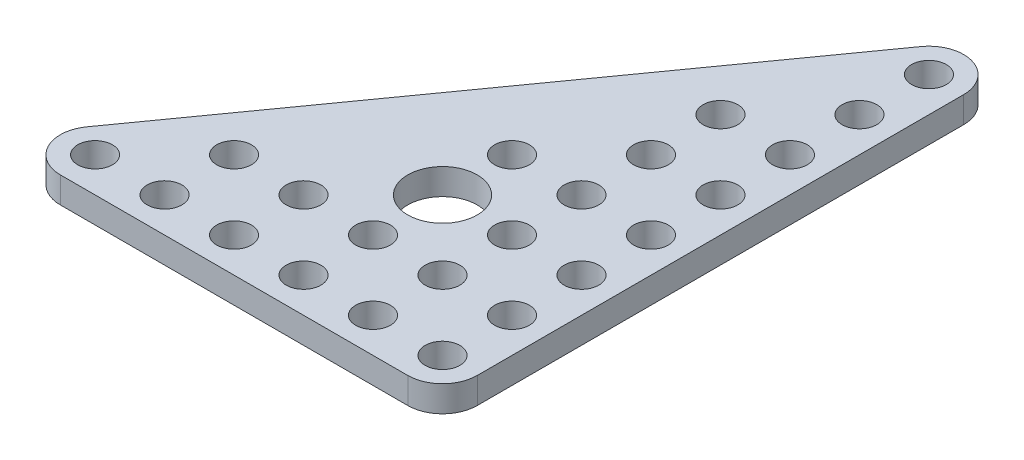
ISO-10303-21;
HEADER;
FILE_DESCRIPTION(('STEP AP214'),'2;1');
FILE_NAME('part.step','',(''),(''),'','','');
FILE_SCHEMA(('AUTOMOTIVE_DESIGN { 1 0 10303 214 1 1 1 1 }'));
ENDSEC;
DATA;
#1=APPLICATION_CONTEXT('core data for automotive mechanical design processes');
#2=APPLICATION_PROTOCOL_DEFINITION('international standard','automotive_design',2000,#1);
#3=PRODUCT_CONTEXT('',#1,'mechanical');
#4=PRODUCT('Part','Part','',(#3));
#5=PRODUCT_RELATED_PRODUCT_CATEGORY('part','',(#4));
#6=PRODUCT_DEFINITION_FORMATION('','',#4);
#7=PRODUCT_DEFINITION_CONTEXT('part definition',#1,'design');
#8=PRODUCT_DEFINITION('design','',#6,#7);
#9=PRODUCT_DEFINITION_SHAPE('','',#8);
#10=(LENGTH_UNIT() NAMED_UNIT(*) SI_UNIT(.MILLI.,.METRE.));
#11=(NAMED_UNIT(*) PLANE_ANGLE_UNIT() SI_UNIT($,.RADIAN.));
#12=(NAMED_UNIT(*) SI_UNIT($,.STERADIAN.) SOLID_ANGLE_UNIT());
#13=UNCERTAINTY_MEASURE_WITH_UNIT(LENGTH_MEASURE(1.E-05),#10,'distance_accuracy_value','');
#14=(GEOMETRIC_REPRESENTATION_CONTEXT(3) GLOBAL_UNCERTAINTY_ASSIGNED_CONTEXT((#13)) GLOBAL_UNIT_ASSIGNED_CONTEXT((#10,
#11,#12)) REPRESENTATION_CONTEXT('',''));
#15=CARTESIAN_POINT('',(0.,0.,0.));
#16=DIRECTION('',(0.,0.,1.));
#17=DIRECTION('',(1.,0.,0.));
#18=AXIS2_PLACEMENT_3D('',#15,#16,#17);
#19=CARTESIAN_POINT('',(13.1803752718985,3.,-33.0711553624912));
#20=DIRECTION('',(0.,-1.,0.));
#21=DIRECTION('',(0.,0.,-1.));
#22=AXIS2_PLACEMENT_3D('',#19,#20,#21);
#23=CYLINDRICAL_SURFACE('',#22,4.);
#24=CARTESIAN_POINT('',(13.1803752718985,0.,-33.0711553624912));
#25=DIRECTION('',(0.,1.,0.));
#26=DIRECTION('',(0.,0.,1.));
#27=AXIS2_PLACEMENT_3D('',#24,#25,#26);
#28=CIRCLE('',#27,4.);
#29=CARTESIAN_POINT('',(17.1803752718985,0.,-33.0711553624912));
#30=VERTEX_POINT('',#29);
#31=CARTESIAN_POINT('',(9.9254413870716,0.,-35.3961081373676));
#32=VERTEX_POINT('',#31);
#33=EDGE_CURVE('E121',#30,#32,#28,.T.);
#34=ORIENTED_EDGE('',*,*,#33,.T.);
#35=DIRECTION('',(0.,-1.,0.));
#36=VECTOR('',#35,1.);
#37=CARTESIAN_POINT('',(9.9254413870716,3.,-35.3961081373676));
#38=LINE('',#37,#36);
#39=CARTESIAN_POINT('',(9.9254413870716,3.,-35.3961081373676));
#40=VERTEX_POINT('',#39);
#41=EDGE_CURVE('E11',#40,#32,#38,.T.);
#42=ORIENTED_EDGE('',*,*,#41,.F.);
#43=CARTESIAN_POINT('',(13.1803752718985,3.,-33.0711553624912));
#44=DIRECTION('',(0.,1.,0.));
#45=DIRECTION('',(0.,0.,1.));
#46=AXIS2_PLACEMENT_3D('',#43,#44,#45);
#47=CIRCLE('',#46,4.);
#48=CARTESIAN_POINT('',(17.1803752718985,3.,-33.0711553624912));
#49=VERTEX_POINT('',#48);
#50=EDGE_CURVE('E133',#49,#40,#47,.T.);
#51=ORIENTED_EDGE('',*,*,#50,.F.);
#52=DIRECTION('',(0.,-1.,0.));
#53=VECTOR('',#52,1.);
#54=CARTESIAN_POINT('',(17.1803752718985,3.,-33.0711553624912));
#55=LINE('',#54,#53);
#56=EDGE_CURVE('E117',#49,#30,#55,.T.);
#57=ORIENTED_EDGE('',*,*,#56,.T.);
#58=EDGE_LOOP('',(#34,#42,#51,#57));
#59=FACE_BOUND('',#58,.T.);
#60=ADVANCED_FACE('F38',(#59),#23,.T.);
#61=CARTESIAN_POINT('',(9.9254413870716,3.,-35.3961081373676));
#62=DIRECTION('',(0.813733471206735,0.,0.581238193719096));
#63=DIRECTION('',(0.581238193719096,0.,-0.813733471206735));
#64=AXIS2_PLACEMENT_3D('',#61,#62,#63);
#65=PLANE('',#64);
#66=DIRECTION('',(-0.581238193719096,0.,0.813733471206735));
#67=VECTOR('',#66,1.);
#68=CARTESIAN_POINT('',(9.9254413870716,0.,-35.3961081373676));
#69=LINE('',#68,#67);
#70=CARTESIAN_POINT('',(-30.0745586129284,0.,20.6038918626324));
#71=VERTEX_POINT('',#70);
#72=EDGE_CURVE('E124',#32,#71,#69,.T.);
#73=ORIENTED_EDGE('',*,*,#72,.T.);
#74=DIRECTION('',(0.,-1.,0.));
#75=VECTOR('',#74,1.);
#76=CARTESIAN_POINT('',(-30.0745586129284,3.,20.6038918626324));
#77=LINE('',#76,#75);
#78=CARTESIAN_POINT('',(-30.0745586129284,3.,20.6038918626324));
#79=VERTEX_POINT('',#78);
#80=EDGE_CURVE('E46',#79,#71,#77,.T.);
#81=ORIENTED_EDGE('',*,*,#80,.F.);
#82=DIRECTION('',(-0.581238193719096,0.,0.813733471206735));
#83=VECTOR('',#82,1.);
#84=CARTESIAN_POINT('',(9.9254413870716,3.,-35.3961081373676));
#85=LINE('',#84,#83);
#86=EDGE_CURVE('E87',#40,#79,#85,.T.);
#87=ORIENTED_EDGE('',*,*,#86,.F.);
#88=ORIENTED_EDGE('',*,*,#41,.T.);
#89=EDGE_LOOP('',(#73,#81,#87,#88));
#90=FACE_BOUND('',#89,.T.);
#91=ADVANCED_FACE('F158',(#90),#65,.F.);
#92=CARTESIAN_POINT('',(-26.8196247281015,3.,22.9288446375088));
#93=DIRECTION('',(0.,-1.,0.));
#94=DIRECTION('',(0.,0.,-1.));
#95=AXIS2_PLACEMENT_3D('',#92,#93,#94);
#96=CYLINDRICAL_SURFACE('',#95,4.00000000000001);
#97=CARTESIAN_POINT('',(-26.8196247281015,0.,22.9288446375088));
#98=DIRECTION('',(0.,1.,0.));
#99=DIRECTION('',(0.,0.,1.));
#100=AXIS2_PLACEMENT_3D('',#97,#98,#99);
#101=CIRCLE('',#100,4.00000000000001);
#102=CARTESIAN_POINT('',(-26.8196247281015,0.,26.9288446375088));
#103=VERTEX_POINT('',#102);
#104=EDGE_CURVE('E127',#71,#103,#101,.T.);
#105=ORIENTED_EDGE('',*,*,#104,.T.);
#106=DIRECTION('',(0.,-1.,0.));
#107=VECTOR('',#106,1.);
#108=CARTESIAN_POINT('',(-26.8196247281015,3.,26.9288446375088));
#109=LINE('',#108,#107);
#110=CARTESIAN_POINT('',(-26.8196247281015,3.,26.9288446375088));
#111=VERTEX_POINT('',#110);
#112=EDGE_CURVE('E113',#111,#103,#109,.T.);
#113=ORIENTED_EDGE('',*,*,#112,.F.);
#114=CARTESIAN_POINT('',(-26.8196247281015,3.,22.9288446375088));
#115=DIRECTION('',(0.,1.,0.));
#116=DIRECTION('',(0.,0.,1.));
#117=AXIS2_PLACEMENT_3D('',#114,#115,#116);
#118=CIRCLE('',#117,4.00000000000001);
#119=EDGE_CURVE('E100',#79,#111,#118,.T.);
#120=ORIENTED_EDGE('',*,*,#119,.F.);
#121=ORIENTED_EDGE('',*,*,#80,.T.);
#122=EDGE_LOOP('',(#105,#113,#120,#121));
#123=FACE_BOUND('',#122,.T.);
#124=ADVANCED_FACE('F139',(#123),#96,.T.);
#125=CARTESIAN_POINT('',(-26.8196247281015,3.,26.9288446375088));
#126=DIRECTION('',(0.,0.,-1.));
#127=DIRECTION('',(-1.,0.,0.));
#128=AXIS2_PLACEMENT_3D('',#125,#126,#127);
#129=PLANE('',#128);
#130=DIRECTION('',(1.,0.,0.));
#131=VECTOR('',#130,1.);
#132=CARTESIAN_POINT('',(-26.8196247281015,0.,26.9288446375088));
#133=LINE('',#132,#131);
#134=CARTESIAN_POINT('',(13.1803752718985,0.,26.9288446375088));
#135=VERTEX_POINT('',#134);
#136=EDGE_CURVE('E109',#103,#135,#133,.T.);
#137=ORIENTED_EDGE('',*,*,#136,.T.);
#138=DIRECTION('',(0.,-1.,0.));
#139=VECTOR('',#138,1.);
#140=CARTESIAN_POINT('',(13.1803752718985,3.,26.9288446375088));
#141=LINE('',#140,#139);
#142=CARTESIAN_POINT('',(13.1803752718985,3.,26.9288446375088));
#143=VERTEX_POINT('',#142);
#144=EDGE_CURVE('E106',#143,#135,#141,.T.);
#145=ORIENTED_EDGE('',*,*,#144,.F.);
#146=DIRECTION('',(1.,0.,0.));
#147=VECTOR('',#146,1.);
#148=CARTESIAN_POINT('',(-26.8196247281015,3.,26.9288446375088));
#149=LINE('',#148,#147);
#150=EDGE_CURVE('E94',#111,#143,#149,.T.);
#151=ORIENTED_EDGE('',*,*,#150,.F.);
#152=ORIENTED_EDGE('',*,*,#112,.T.);
#153=EDGE_LOOP('',(#137,#145,#151,#152));
#154=FACE_BOUND('',#153,.T.);
#155=ADVANCED_FACE('F107',(#154),#129,.F.);
#156=CARTESIAN_POINT('',(13.1803752718985,3.,22.9288446375088));
#157=DIRECTION('',(0.,-1.,0.));
#158=DIRECTION('',(0.,0.,-1.));
#159=AXIS2_PLACEMENT_3D('',#156,#157,#158);
#160=CYLINDRICAL_SURFACE('',#159,4.);
#161=CARTESIAN_POINT('',(13.1803752718985,0.,22.9288446375088));
#162=DIRECTION('',(0.,-1.,0.));
#163=DIRECTION('',(0.,0.,-1.));
#164=AXIS2_PLACEMENT_3D('',#161,#162,#163);
#165=CIRCLE('',#164,4.);
#166=CARTESIAN_POINT('',(17.1803752718985,0.,22.9288446375088));
#167=VERTEX_POINT('',#166);
#168=EDGE_CURVE('E130',#167,#135,#165,.T.);
#169=ORIENTED_EDGE('',*,*,#168,.F.);
#170=DIRECTION('',(0.,-1.,0.));
#171=VECTOR('',#170,1.);
#172=CARTESIAN_POINT('',(17.1803752718985,3.,22.9288446375088));
#173=LINE('',#172,#171);
#174=CARTESIAN_POINT('',(17.1803752718985,3.,22.9288446375088));
#175=VERTEX_POINT('',#174);
#176=EDGE_CURVE('E76',#175,#167,#173,.T.);
#177=ORIENTED_EDGE('',*,*,#176,.F.);
#178=CARTESIAN_POINT('',(13.1803752718985,3.,22.9288446375088));
#179=DIRECTION('',(0.,-1.,0.));
#180=DIRECTION('',(0.,0.,-1.));
#181=AXIS2_PLACEMENT_3D('',#178,#179,#180);
#182=CIRCLE('',#181,4.);
#183=EDGE_CURVE('E98',#175,#143,#182,.T.);
#184=ORIENTED_EDGE('',*,*,#183,.T.);
#185=ORIENTED_EDGE('',*,*,#144,.T.);
#186=EDGE_LOOP('',(#169,#177,#184,#185));
#187=FACE_BOUND('',#186,.T.);
#188=ADVANCED_FACE('F115',(#187),#160,.T.);
#189=CARTESIAN_POINT('',(17.1803752718985,3.,22.9288446375088));
#190=DIRECTION('',(-1.,0.,0.));
#191=DIRECTION('',(0.,0.,1.));
#192=AXIS2_PLACEMENT_3D('',#189,#190,#191);
#193=PLANE('',#192);
#194=DIRECTION('',(0.,0.,-1.));
#195=VECTOR('',#194,1.);
#196=CARTESIAN_POINT('',(17.1803752718985,0.,22.9288446375088));
#197=LINE('',#196,#195);
#198=EDGE_CURVE('E79',#167,#30,#197,.T.);
#199=ORIENTED_EDGE('',*,*,#198,.T.);
#200=ORIENTED_EDGE('',*,*,#56,.F.);
#201=DIRECTION('',(0.,0.,-1.));
#202=VECTOR('',#201,1.);
#203=CARTESIAN_POINT('',(17.1803752718985,3.,22.9288446375088));
#204=LINE('',#203,#202);
#205=EDGE_CURVE('E54',#175,#49,#204,.T.);
#206=ORIENTED_EDGE('',*,*,#205,.F.);
#207=ORIENTED_EDGE('',*,*,#176,.T.);
#208=EDGE_LOOP('',(#199,#200,#206,#207));
#209=FACE_BOUND('',#208,.T.);
#210=ADVANCED_FACE('F146',(#209),#193,.F.);
#211=CARTESIAN_POINT('',(13.1803752718985,3.,-33.0711553624912));
#212=DIRECTION('',(0.,1.,0.));
#213=DIRECTION('',(0.,0.,1.));
#214=AXIS2_PLACEMENT_3D('',#211,#212,#213);
#215=PLANE('',#214);
#216=CARTESIAN_POINT('',(5.18037527189854,3.,14.9288446375088));
#217=DIRECTION('',(0.,1.,0.));
#218=DIRECTION('',(0.,0.,1.));
#219=AXIS2_PLACEMENT_3D('',#216,#217,#218);
#220=CIRCLE('',#219,2.);
#221=CARTESIAN_POINT('',(5.18037527189854,3.,16.9288446375088));
#222=VERTEX_POINT('',#221);
#223=EDGE_CURVE('E125',#222,#222,#220,.F.);
#224=ORIENTED_EDGE('',*,*,#223,.T.);
#225=EDGE_LOOP('',(#224));
#226=FACE_BOUND('',#225,.T.);
#227=CARTESIAN_POINT('',(-2.81962472810146,3.,14.9288446375088));
#228=DIRECTION('',(0.,1.,0.));
#229=DIRECTION('',(0.,0.,1.));
#230=AXIS2_PLACEMENT_3D('',#227,#228,#229);
#231=CIRCLE('',#230,2.);
#232=CARTESIAN_POINT('',(-2.81962472810146,3.,16.9288446375088));
#233=VERTEX_POINT('',#232);
#234=EDGE_CURVE('E536',#233,#233,#231,.F.);
#235=ORIENTED_EDGE('',*,*,#234,.T.);
#236=EDGE_LOOP('',(#235));
#237=FACE_BOUND('',#236,.T.);
#238=CARTESIAN_POINT('',(-10.8196247281015,3.,14.9288446375088));
#239=DIRECTION('',(0.,1.,0.));
#240=DIRECTION('',(0.,0.,1.));
#241=AXIS2_PLACEMENT_3D('',#238,#239,#240);
#242=CIRCLE('',#241,2.);
#243=CARTESIAN_POINT('',(-10.8196247281015,3.,16.9288446375088));
#244=VERTEX_POINT('',#243);
#245=EDGE_CURVE('E533',#244,#244,#242,.F.);
#246=ORIENTED_EDGE('',*,*,#245,.T.);
#247=EDGE_LOOP('',(#246));
#248=FACE_BOUND('',#247,.T.);
#249=CARTESIAN_POINT('',(-18.8196247281015,3.,14.9288446375088));
#250=DIRECTION('',(0.,1.,0.));
#251=DIRECTION('',(0.,0.,1.));
#252=AXIS2_PLACEMENT_3D('',#249,#250,#251);
#253=CIRCLE('',#252,2.);
#254=CARTESIAN_POINT('',(-18.8196247281015,3.,16.9288446375088));
#255=VERTEX_POINT('',#254);
#256=EDGE_CURVE('E530',#255,#255,#253,.F.);
#257=ORIENTED_EDGE('',*,*,#256,.T.);
#258=EDGE_LOOP('',(#257));
#259=FACE_BOUND('',#258,.T.);
#260=CARTESIAN_POINT('',(-26.8196247281015,3.,22.9288446375088));
#261=DIRECTION('',(0.,1.,0.));
#262=DIRECTION('',(0.,0.,1.));
#263=AXIS2_PLACEMENT_3D('',#260,#261,#262);
#264=CIRCLE('',#263,2.);
#265=CARTESIAN_POINT('',(-26.8196247281015,3.,24.9288446375088));
#266=VERTEX_POINT('',#265);
#267=EDGE_CURVE('E527',#266,#266,#264,.F.);
#268=ORIENTED_EDGE('',*,*,#267,.T.);
#269=EDGE_LOOP('',(#268));
#270=FACE_BOUND('',#269,.T.);
#271=CARTESIAN_POINT('',(-18.8196247281015,3.,22.9288446375088));
#272=DIRECTION('',(0.,1.,0.));
#273=DIRECTION('',(0.,0.,1.));
#274=AXIS2_PLACEMENT_3D('',#271,#272,#273);
#275=CIRCLE('',#274,2.00000000000001);
#276=CARTESIAN_POINT('',(-18.8196247281015,3.,24.9288446375088));
#277=VERTEX_POINT('',#276);
#278=EDGE_CURVE('E524',#277,#277,#275,.F.);
#279=ORIENTED_EDGE('',*,*,#278,.T.);
#280=EDGE_LOOP('',(#279));
#281=FACE_BOUND('',#280,.T.);
#282=CARTESIAN_POINT('',(-10.8196247281015,3.,22.9288446375088));
#283=DIRECTION('',(0.,1.,0.));
#284=DIRECTION('',(0.,0.,1.));
#285=AXIS2_PLACEMENT_3D('',#282,#283,#284);
#286=CIRCLE('',#285,2.);
#287=CARTESIAN_POINT('',(-10.8196247281015,3.,24.9288446375088));
#288=VERTEX_POINT('',#287);
#289=EDGE_CURVE('E521',#288,#288,#286,.F.);
#290=ORIENTED_EDGE('',*,*,#289,.T.);
#291=EDGE_LOOP('',(#290));
#292=FACE_BOUND('',#291,.T.);
#293=CARTESIAN_POINT('',(-2.81962472810146,3.,22.9288446375088));
#294=DIRECTION('',(0.,1.,0.));
#295=DIRECTION('',(0.,0.,1.));
#296=AXIS2_PLACEMENT_3D('',#293,#294,#295);
#297=CIRCLE('',#296,2.);
#298=CARTESIAN_POINT('',(-2.81962472810146,3.,24.9288446375088));
#299=VERTEX_POINT('',#298);
#300=EDGE_CURVE('E518',#299,#299,#297,.F.);
#301=ORIENTED_EDGE('',*,*,#300,.T.);
#302=EDGE_LOOP('',(#301));
#303=FACE_BOUND('',#302,.T.);
#304=CARTESIAN_POINT('',(13.1803752718985,3.,14.9288446375088));
#305=DIRECTION('',(0.,1.,0.));
#306=DIRECTION('',(0.,0.,1.));
#307=AXIS2_PLACEMENT_3D('',#304,#305,#306);
#308=CIRCLE('',#307,2.);
#309=CARTESIAN_POINT('',(13.1803752718985,3.,16.9288446375088));
#310=VERTEX_POINT('',#309);
#311=EDGE_CURVE('E515',#310,#310,#308,.F.);
#312=ORIENTED_EDGE('',*,*,#311,.T.);
#313=EDGE_LOOP('',(#312));
#314=FACE_BOUND('',#313,.T.);
#315=CARTESIAN_POINT('',(13.1803752718985,3.,6.92884463750881));
#316=DIRECTION('',(0.,1.,0.));
#317=DIRECTION('',(0.,0.,1.));
#318=AXIS2_PLACEMENT_3D('',#315,#316,#317);
#319=CIRCLE('',#318,2.);
#320=CARTESIAN_POINT('',(13.1803752718985,3.,8.92884463750881));
#321=VERTEX_POINT('',#320);
#322=EDGE_CURVE('E512',#321,#321,#319,.F.);
#323=ORIENTED_EDGE('',*,*,#322,.T.);
#324=EDGE_LOOP('',(#323));
#325=FACE_BOUND('',#324,.T.);
#326=CARTESIAN_POINT('',(13.1803752718985,3.,-1.07115536249119));
#327=DIRECTION('',(0.,1.,0.));
#328=DIRECTION('',(0.,0.,1.));
#329=AXIS2_PLACEMENT_3D('',#326,#327,#328);
#330=CIRCLE('',#329,2.);
#331=CARTESIAN_POINT('',(13.1803752718985,3.,0.928844637508809));
#332=VERTEX_POINT('',#331);
#333=EDGE_CURVE('E509',#332,#332,#330,.F.);
#334=ORIENTED_EDGE('',*,*,#333,.T.);
#335=EDGE_LOOP('',(#334));
#336=FACE_BOUND('',#335,.T.);
#337=CARTESIAN_POINT('',(13.1803752718985,3.,-9.07115536249119));
#338=DIRECTION('',(0.,1.,0.));
#339=DIRECTION('',(0.,0.,1.));
#340=AXIS2_PLACEMENT_3D('',#337,#338,#339);
#341=CIRCLE('',#340,2.);
#342=CARTESIAN_POINT('',(13.1803752718985,3.,-7.07115536249119));
#343=VERTEX_POINT('',#342);
#344=EDGE_CURVE('E506',#343,#343,#341,.F.);
#345=ORIENTED_EDGE('',*,*,#344,.T.);
#346=EDGE_LOOP('',(#345));
#347=FACE_BOUND('',#346,.T.);
#348=CARTESIAN_POINT('',(5.18037527189854,3.,22.9288446375088));
#349=DIRECTION('',(0.,1.,0.));
#350=DIRECTION('',(0.,0.,1.));
#351=AXIS2_PLACEMENT_3D('',#348,#349,#350);
#352=CIRCLE('',#351,2.);
#353=CARTESIAN_POINT('',(5.18037527189854,3.,24.9288446375088));
#354=VERTEX_POINT('',#353);
#355=EDGE_CURVE('E503',#354,#354,#352,.F.);
#356=ORIENTED_EDGE('',*,*,#355,.T.);
#357=EDGE_LOOP('',(#356));
#358=FACE_BOUND('',#357,.T.);
#359=CARTESIAN_POINT('',(13.1803752718985,3.,-33.0711553624912));
#360=DIRECTION('',(0.,1.,0.));
#361=DIRECTION('',(0.,0.,1.));
#362=AXIS2_PLACEMENT_3D('',#359,#360,#361);
#363=CIRCLE('',#362,2.);
#364=CARTESIAN_POINT('',(13.1803752718985,3.,-31.0711553624912));
#365=VERTEX_POINT('',#364);
#366=EDGE_CURVE('E500',#365,#365,#363,.F.);
#367=ORIENTED_EDGE('',*,*,#366,.T.);
#368=EDGE_LOOP('',(#367));
#369=FACE_BOUND('',#368,.T.);
#370=CARTESIAN_POINT('',(13.1803752718985,3.,-25.0711553624912));
#371=DIRECTION('',(0.,1.,0.));
#372=DIRECTION('',(0.,0.,1.));
#373=AXIS2_PLACEMENT_3D('',#370,#371,#372);
#374=CIRCLE('',#373,2.);
#375=CARTESIAN_POINT('',(13.1803752718985,3.,-23.0711553624912));
#376=VERTEX_POINT('',#375);
#377=EDGE_CURVE('E497',#376,#376,#374,.F.);
#378=ORIENTED_EDGE('',*,*,#377,.T.);
#379=EDGE_LOOP('',(#378));
#380=FACE_BOUND('',#379,.T.);
#381=CARTESIAN_POINT('',(13.1803752718985,3.,-17.0711553624912));
#382=DIRECTION('',(0.,1.,0.));
#383=DIRECTION('',(0.,0.,1.));
#384=AXIS2_PLACEMENT_3D('',#381,#382,#383);
#385=CIRCLE('',#384,2.);
#386=CARTESIAN_POINT('',(13.1803752718985,3.,-15.0711553624912));
#387=VERTEX_POINT('',#386);
#388=EDGE_CURVE('E494',#387,#387,#385,.F.);
#389=ORIENTED_EDGE('',*,*,#388,.T.);
#390=EDGE_LOOP('',(#389));
#391=FACE_BOUND('',#390,.T.);
#392=CARTESIAN_POINT('',(5.18037527189854,3.,6.92884463750881));
#393=DIRECTION('',(0.,1.,0.));
#394=DIRECTION('',(0.,0.,1.));
#395=AXIS2_PLACEMENT_3D('',#392,#393,#394);
#396=CIRCLE('',#395,2.);
#397=CARTESIAN_POINT('',(5.18037527189854,3.,8.92884463750881));
#398=VERTEX_POINT('',#397);
#399=EDGE_CURVE('E491',#398,#398,#396,.F.);
#400=ORIENTED_EDGE('',*,*,#399,.T.);
#401=EDGE_LOOP('',(#400));
#402=FACE_BOUND('',#401,.T.);
#403=CARTESIAN_POINT('',(5.18037527189854,3.,-1.07115536249119));
#404=DIRECTION('',(0.,1.,0.));
#405=DIRECTION('',(0.,0.,1.));
#406=AXIS2_PLACEMENT_3D('',#403,#404,#405);
#407=CIRCLE('',#406,2.);
#408=CARTESIAN_POINT('',(5.18037527189854,3.,0.92884463750881));
#409=VERTEX_POINT('',#408);
#410=EDGE_CURVE('E488',#409,#409,#407,.F.);
#411=ORIENTED_EDGE('',*,*,#410,.T.);
#412=EDGE_LOOP('',(#411));
#413=FACE_BOUND('',#412,.T.);
#414=CARTESIAN_POINT('',(5.18037527189854,3.,-9.07115536249119));
#415=DIRECTION('',(0.,1.,0.));
#416=DIRECTION('',(0.,0.,1.));
#417=AXIS2_PLACEMENT_3D('',#414,#415,#416);
#418=CIRCLE('',#417,2.);
#419=CARTESIAN_POINT('',(5.18037527189854,3.,-7.07115536249119));
#420=VERTEX_POINT('',#419);
#421=EDGE_CURVE('E485',#420,#420,#418,.F.);
#422=ORIENTED_EDGE('',*,*,#421,.T.);
#423=EDGE_LOOP('',(#422));
#424=FACE_BOUND('',#423,.T.);
#425=CARTESIAN_POINT('',(5.18037527189854,3.,-17.0711553624912));
#426=DIRECTION('',(0.,1.,0.));
#427=DIRECTION('',(0.,0.,1.));
#428=AXIS2_PLACEMENT_3D('',#425,#426,#427);
#429=CIRCLE('',#428,2.);
#430=CARTESIAN_POINT('',(5.18037527189854,3.,-15.0711553624912));
#431=VERTEX_POINT('',#430);
#432=EDGE_CURVE('E482',#431,#431,#429,.F.);
#433=ORIENTED_EDGE('',*,*,#432,.T.);
#434=EDGE_LOOP('',(#433));
#435=FACE_BOUND('',#434,.T.);
#436=CARTESIAN_POINT('',(-2.81962472810146,3.,-1.07115536249119));
#437=DIRECTION('',(0.,1.,0.));
#438=DIRECTION('',(0.,0.,1.));
#439=AXIS2_PLACEMENT_3D('',#436,#437,#438);
#440=CIRCLE('',#439,2.);
#441=CARTESIAN_POINT('',(-2.81962472810146,3.,0.92884463750881));
#442=VERTEX_POINT('',#441);
#443=EDGE_CURVE('E479',#442,#442,#440,.F.);
#444=ORIENTED_EDGE('',*,*,#443,.T.);
#445=EDGE_LOOP('',(#444));
#446=FACE_BOUND('',#445,.T.);
#447=CARTESIAN_POINT('',(-2.81962472810146,3.,6.92884463750881));
#448=DIRECTION('',(0.,1.,0.));
#449=DIRECTION('',(0.,0.,1.));
#450=AXIS2_PLACEMENT_3D('',#447,#448,#449);
#451=CIRCLE('',#450,4.);
#452=CARTESIAN_POINT('',(-2.81962472810146,3.,10.9288446375088));
#453=VERTEX_POINT('',#452);
#454=EDGE_CURVE('E476',#453,#453,#451,.F.);
#455=ORIENTED_EDGE('',*,*,#454,.T.);
#456=EDGE_LOOP('',(#455));
#457=FACE_BOUND('',#456,.T.);
#458=CARTESIAN_POINT('',(13.1803752718985,3.,22.9288446375088));
#459=DIRECTION('',(0.,1.,0.));
#460=DIRECTION('',(0.,0.,1.));
#461=AXIS2_PLACEMENT_3D('',#458,#459,#460);
#462=CIRCLE('',#461,2.);
#463=CARTESIAN_POINT('',(13.1803752718985,3.,24.9288446375088));
#464=VERTEX_POINT('',#463);
#465=EDGE_CURVE('E473',#464,#464,#462,.F.);
#466=ORIENTED_EDGE('',*,*,#465,.T.);
#467=EDGE_LOOP('',(#466));
#468=FACE_BOUND('',#467,.T.);
#469=ORIENTED_EDGE('',*,*,#50,.T.);
#470=ORIENTED_EDGE('',*,*,#86,.T.);
#471=ORIENTED_EDGE('',*,*,#119,.T.);
#472=ORIENTED_EDGE('',*,*,#150,.T.);
#473=ORIENTED_EDGE('',*,*,#183,.F.);
#474=ORIENTED_EDGE('',*,*,#205,.T.);
#475=EDGE_LOOP('',(#469,#470,#471,#472,#473,#474));
#476=FACE_BOUND('',#475,.T.);
#477=ADVANCED_FACE('F96',(#226,#237,#248,#259,#270,#281,#292,#303,#314,#325,#336,#347,#358,#369,
#380,#391,#402,#413,#424,#435,#446,#457,#468,#476),#215,.T.);
#478=CARTESIAN_POINT('',(13.1803752718985,0.,-33.0711553624912));
#479=DIRECTION('',(0.,1.,0.));
#480=DIRECTION('',(0.,0.,1.));
#481=AXIS2_PLACEMENT_3D('',#478,#479,#480);
#482=PLANE('',#481);
#483=CARTESIAN_POINT('',(5.18037527189854,0.,14.9288446375088));
#484=DIRECTION('',(0.,1.,0.));
#485=DIRECTION('',(0.,0.,1.));
#486=AXIS2_PLACEMENT_3D('',#483,#484,#485);
#487=CIRCLE('',#486,2.);
#488=CARTESIAN_POINT('',(5.18037527189854,0.,16.9288446375088));
#489=VERTEX_POINT('',#488);
#490=EDGE_CURVE('E433',#489,#489,#487,.T.);
#491=ORIENTED_EDGE('',*,*,#490,.T.);
#492=EDGE_LOOP('',(#491));
#493=FACE_BOUND('',#492,.T.);
#494=CARTESIAN_POINT('',(-2.81962472810146,0.,14.9288446375088));
#495=DIRECTION('',(0.,1.,0.));
#496=DIRECTION('',(0.,0.,1.));
#497=AXIS2_PLACEMENT_3D('',#494,#495,#496);
#498=CIRCLE('',#497,2.);
#499=CARTESIAN_POINT('',(-2.81962472810146,0.,16.9288446375088));
#500=VERTEX_POINT('',#499);
#501=EDGE_CURVE('E434',#500,#500,#498,.T.);
#502=ORIENTED_EDGE('',*,*,#501,.T.);
#503=EDGE_LOOP('',(#502));
#504=FACE_BOUND('',#503,.T.);
#505=CARTESIAN_POINT('',(-10.8196247281015,0.,14.9288446375088));
#506=DIRECTION('',(0.,1.,0.));
#507=DIRECTION('',(0.,0.,1.));
#508=AXIS2_PLACEMENT_3D('',#505,#506,#507);
#509=CIRCLE('',#508,2.);
#510=CARTESIAN_POINT('',(-10.8196247281015,0.,16.9288446375088));
#511=VERTEX_POINT('',#510);
#512=EDGE_CURVE('E438',#511,#511,#509,.T.);
#513=ORIENTED_EDGE('',*,*,#512,.T.);
#514=EDGE_LOOP('',(#513));
#515=FACE_BOUND('',#514,.T.);
#516=CARTESIAN_POINT('',(-18.8196247281015,0.,14.9288446375088));
#517=DIRECTION('',(0.,1.,0.));
#518=DIRECTION('',(0.,0.,1.));
#519=AXIS2_PLACEMENT_3D('',#516,#517,#518);
#520=CIRCLE('',#519,2.);
#521=CARTESIAN_POINT('',(-18.8196247281015,0.,16.9288446375088));
#522=VERTEX_POINT('',#521);
#523=EDGE_CURVE('E611',#522,#522,#520,.T.);
#524=ORIENTED_EDGE('',*,*,#523,.T.);
#525=EDGE_LOOP('',(#524));
#526=FACE_BOUND('',#525,.T.);
#527=CARTESIAN_POINT('',(-26.8196247281015,0.,22.9288446375088));
#528=DIRECTION('',(0.,1.,0.));
#529=DIRECTION('',(0.,0.,1.));
#530=AXIS2_PLACEMENT_3D('',#527,#528,#529);
#531=CIRCLE('',#530,2.);
#532=CARTESIAN_POINT('',(-26.8196247281015,0.,24.9288446375088));
#533=VERTEX_POINT('',#532);
#534=EDGE_CURVE('E608',#533,#533,#531,.T.);
#535=ORIENTED_EDGE('',*,*,#534,.T.);
#536=EDGE_LOOP('',(#535));
#537=FACE_BOUND('',#536,.T.);
#538=CARTESIAN_POINT('',(-18.8196247281015,0.,22.9288446375088));
#539=DIRECTION('',(0.,1.,0.));
#540=DIRECTION('',(0.,0.,1.));
#541=AXIS2_PLACEMENT_3D('',#538,#539,#540);
#542=CIRCLE('',#541,2.00000000000001);
#543=CARTESIAN_POINT('',(-18.8196247281015,0.,24.9288446375088));
#544=VERTEX_POINT('',#543);
#545=EDGE_CURVE('E605',#544,#544,#542,.T.);
#546=ORIENTED_EDGE('',*,*,#545,.T.);
#547=EDGE_LOOP('',(#546));
#548=FACE_BOUND('',#547,.T.);
#549=CARTESIAN_POINT('',(-10.8196247281015,0.,22.9288446375088));
#550=DIRECTION('',(0.,1.,0.));
#551=DIRECTION('',(0.,0.,1.));
#552=AXIS2_PLACEMENT_3D('',#549,#550,#551);
#553=CIRCLE('',#552,2.);
#554=CARTESIAN_POINT('',(-10.8196247281015,0.,24.9288446375088));
#555=VERTEX_POINT('',#554);
#556=EDGE_CURVE('E602',#555,#555,#553,.T.);
#557=ORIENTED_EDGE('',*,*,#556,.T.);
#558=EDGE_LOOP('',(#557));
#559=FACE_BOUND('',#558,.T.);
#560=CARTESIAN_POINT('',(-2.81962472810146,0.,22.9288446375088));
#561=DIRECTION('',(0.,1.,0.));
#562=DIRECTION('',(0.,0.,1.));
#563=AXIS2_PLACEMENT_3D('',#560,#561,#562);
#564=CIRCLE('',#563,2.);
#565=CARTESIAN_POINT('',(-2.81962472810146,0.,24.9288446375088));
#566=VERTEX_POINT('',#565);
#567=EDGE_CURVE('E452',#566,#566,#564,.T.);
#568=ORIENTED_EDGE('',*,*,#567,.T.);
#569=EDGE_LOOP('',(#568));
#570=FACE_BOUND('',#569,.T.);
#571=CARTESIAN_POINT('',(13.1803752718985,0.,14.9288446375088));
#572=DIRECTION('',(0.,1.,0.));
#573=DIRECTION('',(0.,0.,1.));
#574=AXIS2_PLACEMENT_3D('',#571,#572,#573);
#575=CIRCLE('',#574,2.);
#576=CARTESIAN_POINT('',(13.1803752718985,0.,16.9288446375088));
#577=VERTEX_POINT('',#576);
#578=EDGE_CURVE('E459',#577,#577,#575,.T.);
#579=ORIENTED_EDGE('',*,*,#578,.T.);
#580=EDGE_LOOP('',(#579));
#581=FACE_BOUND('',#580,.T.);
#582=CARTESIAN_POINT('',(13.1803752718985,0.,6.92884463750881));
#583=DIRECTION('',(0.,1.,0.));
#584=DIRECTION('',(0.,0.,1.));
#585=AXIS2_PLACEMENT_3D('',#582,#583,#584);
#586=CIRCLE('',#585,2.);
#587=CARTESIAN_POINT('',(13.1803752718985,0.,8.92884463750881));
#588=VERTEX_POINT('',#587);
#589=EDGE_CURVE('E463',#588,#588,#586,.T.);
#590=ORIENTED_EDGE('',*,*,#589,.T.);
#591=EDGE_LOOP('',(#590));
#592=FACE_BOUND('',#591,.T.);
#593=CARTESIAN_POINT('',(13.1803752718985,0.,-1.07115536249119));
#594=DIRECTION('',(0.,1.,0.));
#595=DIRECTION('',(0.,0.,1.));
#596=AXIS2_PLACEMENT_3D('',#593,#594,#595);
#597=CIRCLE('',#596,2.);
#598=CARTESIAN_POINT('',(13.1803752718985,0.,0.928844637508809));
#599=VERTEX_POINT('',#598);
#600=EDGE_CURVE('E466',#599,#599,#597,.T.);
#601=ORIENTED_EDGE('',*,*,#600,.T.);
#602=EDGE_LOOP('',(#601));
#603=FACE_BOUND('',#602,.T.);
#604=CARTESIAN_POINT('',(13.1803752718985,0.,-9.07115536249119));
#605=DIRECTION('',(0.,1.,0.));
#606=DIRECTION('',(0.,0.,1.));
#607=AXIS2_PLACEMENT_3D('',#604,#605,#606);
#608=CIRCLE('',#607,2.);
#609=CARTESIAN_POINT('',(13.1803752718985,0.,-7.07115536249119));
#610=VERTEX_POINT('',#609);
#611=EDGE_CURVE('E456',#610,#610,#608,.T.);
#612=ORIENTED_EDGE('',*,*,#611,.T.);
#613=EDGE_LOOP('',(#612));
#614=FACE_BOUND('',#613,.T.);
#615=CARTESIAN_POINT('',(5.18037527189854,0.,22.9288446375088));
#616=DIRECTION('',(0.,1.,0.));
#617=DIRECTION('',(0.,0.,1.));
#618=AXIS2_PLACEMENT_3D('',#615,#616,#617);
#619=CIRCLE('',#618,2.);
#620=CARTESIAN_POINT('',(5.18037527189854,0.,24.9288446375088));
#621=VERTEX_POINT('',#620);
#622=EDGE_CURVE('E449',#621,#621,#619,.T.);
#623=ORIENTED_EDGE('',*,*,#622,.T.);
#624=EDGE_LOOP('',(#623));
#625=FACE_BOUND('',#624,.T.);
#626=CARTESIAN_POINT('',(13.1803752718985,0.,-33.0711553624912));
#627=DIRECTION('',(0.,1.,0.));
#628=DIRECTION('',(0.,0.,1.));
#629=AXIS2_PLACEMENT_3D('',#626,#627,#628);
#630=CIRCLE('',#629,2.);
#631=CARTESIAN_POINT('',(13.1803752718985,0.,-31.0711553624912));
#632=VERTEX_POINT('',#631);
#633=EDGE_CURVE('E445',#632,#632,#630,.T.);
#634=ORIENTED_EDGE('',*,*,#633,.T.);
#635=EDGE_LOOP('',(#634));
#636=FACE_BOUND('',#635,.T.);
#637=CARTESIAN_POINT('',(13.1803752718985,0.,-25.0711553624912));
#638=DIRECTION('',(0.,1.,0.));
#639=DIRECTION('',(0.,0.,1.));
#640=AXIS2_PLACEMENT_3D('',#637,#638,#639);
#641=CIRCLE('',#640,2.);
#642=CARTESIAN_POINT('',(13.1803752718985,0.,-23.0711553624912));
#643=VERTEX_POINT('',#642);
#644=EDGE_CURVE('E448',#643,#643,#641,.T.);
#645=ORIENTED_EDGE('',*,*,#644,.T.);
#646=EDGE_LOOP('',(#645));
#647=FACE_BOUND('',#646,.T.);
#648=CARTESIAN_POINT('',(13.1803752718985,0.,-17.0711553624912));
#649=DIRECTION('',(0.,1.,0.));
#650=DIRECTION('',(0.,0.,1.));
#651=AXIS2_PLACEMENT_3D('',#648,#649,#650);
#652=CIRCLE('',#651,2.);
#653=CARTESIAN_POINT('',(13.1803752718985,0.,-15.0711553624912));
#654=VERTEX_POINT('',#653);
#655=EDGE_CURVE('E453',#654,#654,#652,.T.);
#656=ORIENTED_EDGE('',*,*,#655,.T.);
#657=EDGE_LOOP('',(#656));
#658=FACE_BOUND('',#657,.T.);
#659=CARTESIAN_POINT('',(5.18037527189854,0.,6.92884463750881));
#660=DIRECTION('',(0.,1.,0.));
#661=DIRECTION('',(0.,0.,1.));
#662=AXIS2_PLACEMENT_3D('',#659,#660,#661);
#663=CIRCLE('',#662,2.);
#664=CARTESIAN_POINT('',(5.18037527189854,0.,8.92884463750881));
#665=VERTEX_POINT('',#664);
#666=EDGE_CURVE('E435',#665,#665,#663,.T.);
#667=ORIENTED_EDGE('',*,*,#666,.T.);
#668=EDGE_LOOP('',(#667));
#669=FACE_BOUND('',#668,.T.);
#670=CARTESIAN_POINT('',(5.18037527189854,0.,-1.07115536249119));
#671=DIRECTION('',(0.,1.,0.));
#672=DIRECTION('',(0.,0.,1.));
#673=AXIS2_PLACEMENT_3D('',#670,#671,#672);
#674=CIRCLE('',#673,2.);
#675=CARTESIAN_POINT('',(5.18037527189854,0.,0.92884463750881));
#676=VERTEX_POINT('',#675);
#677=EDGE_CURVE('E441',#676,#676,#674,.T.);
#678=ORIENTED_EDGE('',*,*,#677,.T.);
#679=EDGE_LOOP('',(#678));
#680=FACE_BOUND('',#679,.T.);
#681=CARTESIAN_POINT('',(5.18037527189854,0.,-9.07115536249119));
#682=DIRECTION('',(0.,1.,0.));
#683=DIRECTION('',(0.,0.,1.));
#684=AXIS2_PLACEMENT_3D('',#681,#682,#683);
#685=CIRCLE('',#684,2.);
#686=CARTESIAN_POINT('',(5.18037527189854,0.,-7.07115536249119));
#687=VERTEX_POINT('',#686);
#688=EDGE_CURVE('E652',#687,#687,#685,.T.);
#689=ORIENTED_EDGE('',*,*,#688,.T.);
#690=EDGE_LOOP('',(#689));
#691=FACE_BOUND('',#690,.T.);
#692=CARTESIAN_POINT('',(5.18037527189854,0.,-17.0711553624912));
#693=DIRECTION('',(0.,1.,0.));
#694=DIRECTION('',(0.,0.,1.));
#695=AXIS2_PLACEMENT_3D('',#692,#693,#694);
#696=CIRCLE('',#695,2.);
#697=CARTESIAN_POINT('',(5.18037527189854,0.,-15.0711553624912));
#698=VERTEX_POINT('',#697);
#699=EDGE_CURVE('E596',#698,#698,#696,.T.);
#700=ORIENTED_EDGE('',*,*,#699,.T.);
#701=EDGE_LOOP('',(#700));
#702=FACE_BOUND('',#701,.T.);
#703=CARTESIAN_POINT('',(-2.81962472810146,0.,-1.07115536249119));
#704=DIRECTION('',(0.,1.,0.));
#705=DIRECTION('',(0.,0.,1.));
#706=AXIS2_PLACEMENT_3D('',#703,#704,#705);
#707=CIRCLE('',#706,2.);
#708=CARTESIAN_POINT('',(-2.81962472810146,0.,0.92884463750881));
#709=VERTEX_POINT('',#708);
#710=EDGE_CURVE('E593',#709,#709,#707,.T.);
#711=ORIENTED_EDGE('',*,*,#710,.T.);
#712=EDGE_LOOP('',(#711));
#713=FACE_BOUND('',#712,.T.);
#714=CARTESIAN_POINT('',(-2.81962472810146,0.,6.92884463750881));
#715=DIRECTION('',(0.,1.,0.));
#716=DIRECTION('',(0.,0.,1.));
#717=AXIS2_PLACEMENT_3D('',#714,#715,#716);
#718=CIRCLE('',#717,4.);
#719=CARTESIAN_POINT('',(-2.81962472810146,0.,10.9288446375088));
#720=VERTEX_POINT('',#719);
#721=EDGE_CURVE('E591',#720,#720,#718,.T.);
#722=ORIENTED_EDGE('',*,*,#721,.T.);
#723=EDGE_LOOP('',(#722));
#724=FACE_BOUND('',#723,.T.);
#725=CARTESIAN_POINT('',(13.1803752718985,0.,22.9288446375088));
#726=DIRECTION('',(0.,1.,0.));
#727=DIRECTION('',(0.,0.,1.));
#728=AXIS2_PLACEMENT_3D('',#725,#726,#727);
#729=CIRCLE('',#728,2.);
#730=CARTESIAN_POINT('',(13.1803752718985,0.,24.9288446375088));
#731=VERTEX_POINT('',#730);
#732=EDGE_CURVE('E462',#731,#731,#729,.T.);
#733=ORIENTED_EDGE('',*,*,#732,.T.);
#734=EDGE_LOOP('',(#733));
#735=FACE_BOUND('',#734,.T.);
#736=ORIENTED_EDGE('',*,*,#33,.F.);
#737=ORIENTED_EDGE('',*,*,#198,.F.);
#738=ORIENTED_EDGE('',*,*,#168,.T.);
#739=ORIENTED_EDGE('',*,*,#136,.F.);
#740=ORIENTED_EDGE('',*,*,#104,.F.);
#741=ORIENTED_EDGE('',*,*,#72,.F.);
#742=EDGE_LOOP('',(#736,#737,#738,#739,#740,#741));
#743=FACE_BOUND('',#742,.T.);
#744=ADVANCED_FACE('F142',(#493,#504,#515,#526,#537,#548,#559,#570,#581,#592,#603,#614,#625,
#636,#647,#658,#669,#680,#691,#702,#713,#724,#735,#743),#482,.F.);
#745=CARTESIAN_POINT('',(13.1803752718985,7.,22.9288446375088));
#746=DIRECTION('',(0.,-1.,0.));
#747=DIRECTION('',(0.,0.,-1.));
#748=AXIS2_PLACEMENT_3D('',#745,#746,#747);
#749=CYLINDRICAL_SURFACE('',#748,2.);
#750=ORIENTED_EDGE('',*,*,#465,.F.);
#751=EDGE_LOOP('',(#750));
#752=FACE_BOUND('',#751,.T.);
#753=ORIENTED_EDGE('',*,*,#732,.F.);
#754=EDGE_LOOP('',(#753));
#755=FACE_BOUND('',#754,.T.);
#756=ADVANCED_FACE('F195',(#752,#755),#749,.F.);
#757=CARTESIAN_POINT('',(-2.81962472810146,7.,6.92884463750881));
#758=DIRECTION('',(0.,-1.,0.));
#759=DIRECTION('',(0.,0.,-1.));
#760=AXIS2_PLACEMENT_3D('',#757,#758,#759);
#761=CYLINDRICAL_SURFACE('',#760,4.);
#762=ORIENTED_EDGE('',*,*,#454,.F.);
#763=EDGE_LOOP('',(#762));
#764=FACE_BOUND('',#763,.T.);
#765=ORIENTED_EDGE('',*,*,#721,.F.);
#766=EDGE_LOOP('',(#765));
#767=FACE_BOUND('',#766,.T.);
#768=ADVANCED_FACE('F204',(#764,#767),#761,.F.);
#769=CARTESIAN_POINT('',(-2.81962472810146,7.,-1.07115536249119));
#770=DIRECTION('',(0.,-1.,0.));
#771=DIRECTION('',(0.,0.,-1.));
#772=AXIS2_PLACEMENT_3D('',#769,#770,#771);
#773=CYLINDRICAL_SURFACE('',#772,2.);
#774=ORIENTED_EDGE('',*,*,#443,.F.);
#775=EDGE_LOOP('',(#774));
#776=FACE_BOUND('',#775,.T.);
#777=ORIENTED_EDGE('',*,*,#710,.F.);
#778=EDGE_LOOP('',(#777));
#779=FACE_BOUND('',#778,.T.);
#780=ADVANCED_FACE('F214',(#776,#779),#773,.F.);
#781=CARTESIAN_POINT('',(5.18037527189854,7.,-17.0711553624912));
#782=DIRECTION('',(0.,-1.,0.));
#783=DIRECTION('',(0.,0.,-1.));
#784=AXIS2_PLACEMENT_3D('',#781,#782,#783);
#785=CYLINDRICAL_SURFACE('',#784,2.);
#786=ORIENTED_EDGE('',*,*,#432,.F.);
#787=EDGE_LOOP('',(#786));
#788=FACE_BOUND('',#787,.T.);
#789=ORIENTED_EDGE('',*,*,#699,.F.);
#790=EDGE_LOOP('',(#789));
#791=FACE_BOUND('',#790,.T.);
#792=ADVANCED_FACE('F224',(#788,#791),#785,.F.);
#793=CARTESIAN_POINT('',(5.18037527189854,7.,-9.07115536249119));
#794=DIRECTION('',(0.,-1.,0.));
#795=DIRECTION('',(0.,0.,-1.));
#796=AXIS2_PLACEMENT_3D('',#793,#794,#795);
#797=CYLINDRICAL_SURFACE('',#796,2.);
#798=ORIENTED_EDGE('',*,*,#421,.F.);
#799=EDGE_LOOP('',(#798));
#800=FACE_BOUND('',#799,.T.);
#801=ORIENTED_EDGE('',*,*,#688,.F.);
#802=EDGE_LOOP('',(#801));
#803=FACE_BOUND('',#802,.T.);
#804=ADVANCED_FACE('F234',(#800,#803),#797,.F.);
#805=CARTESIAN_POINT('',(5.18037527189854,7.,-1.07115536249119));
#806=DIRECTION('',(0.,-1.,0.));
#807=DIRECTION('',(0.,0.,-1.));
#808=AXIS2_PLACEMENT_3D('',#805,#806,#807);
#809=CYLINDRICAL_SURFACE('',#808,2.);
#810=ORIENTED_EDGE('',*,*,#410,.F.);
#811=EDGE_LOOP('',(#810));
#812=FACE_BOUND('',#811,.T.);
#813=ORIENTED_EDGE('',*,*,#677,.F.);
#814=EDGE_LOOP('',(#813));
#815=FACE_BOUND('',#814,.T.);
#816=ADVANCED_FACE('F244',(#812,#815),#809,.F.);
#817=CARTESIAN_POINT('',(5.18037527189854,7.,6.92884463750881));
#818=DIRECTION('',(0.,-1.,0.));
#819=DIRECTION('',(0.,0.,-1.));
#820=AXIS2_PLACEMENT_3D('',#817,#818,#819);
#821=CYLINDRICAL_SURFACE('',#820,2.);
#822=ORIENTED_EDGE('',*,*,#399,.F.);
#823=EDGE_LOOP('',(#822));
#824=FACE_BOUND('',#823,.T.);
#825=ORIENTED_EDGE('',*,*,#666,.F.);
#826=EDGE_LOOP('',(#825));
#827=FACE_BOUND('',#826,.T.);
#828=ADVANCED_FACE('F254',(#824,#827),#821,.F.);
#829=CARTESIAN_POINT('',(13.1803752718985,7.,-17.0711553624912));
#830=DIRECTION('',(0.,-1.,0.));
#831=DIRECTION('',(0.,0.,-1.));
#832=AXIS2_PLACEMENT_3D('',#829,#830,#831);
#833=CYLINDRICAL_SURFACE('',#832,2.);
#834=ORIENTED_EDGE('',*,*,#388,.F.);
#835=EDGE_LOOP('',(#834));
#836=FACE_BOUND('',#835,.T.);
#837=ORIENTED_EDGE('',*,*,#655,.F.);
#838=EDGE_LOOP('',(#837));
#839=FACE_BOUND('',#838,.T.);
#840=ADVANCED_FACE('F264',(#836,#839),#833,.F.);
#841=CARTESIAN_POINT('',(13.1803752718985,7.,-25.0711553624912));
#842=DIRECTION('',(0.,-1.,0.));
#843=DIRECTION('',(0.,0.,-1.));
#844=AXIS2_PLACEMENT_3D('',#841,#842,#843);
#845=CYLINDRICAL_SURFACE('',#844,2.);
#846=ORIENTED_EDGE('',*,*,#377,.F.);
#847=EDGE_LOOP('',(#846));
#848=FACE_BOUND('',#847,.T.);
#849=ORIENTED_EDGE('',*,*,#644,.F.);
#850=EDGE_LOOP('',(#849));
#851=FACE_BOUND('',#850,.T.);
#852=ADVANCED_FACE('F274',(#848,#851),#845,.F.);
#853=CARTESIAN_POINT('',(13.1803752718985,7.,-33.0711553624912));
#854=DIRECTION('',(0.,-1.,0.));
#855=DIRECTION('',(0.,0.,-1.));
#856=AXIS2_PLACEMENT_3D('',#853,#854,#855);
#857=CYLINDRICAL_SURFACE('',#856,2.);
#858=ORIENTED_EDGE('',*,*,#366,.F.);
#859=EDGE_LOOP('',(#858));
#860=FACE_BOUND('',#859,.T.);
#861=ORIENTED_EDGE('',*,*,#633,.F.);
#862=EDGE_LOOP('',(#861));
#863=FACE_BOUND('',#862,.T.);
#864=ADVANCED_FACE('F284',(#860,#863),#857,.F.);
#865=CARTESIAN_POINT('',(5.18037527189854,7.,22.9288446375088));
#866=DIRECTION('',(0.,-1.,0.));
#867=DIRECTION('',(0.,0.,-1.));
#868=AXIS2_PLACEMENT_3D('',#865,#866,#867);
#869=CYLINDRICAL_SURFACE('',#868,2.);
#870=ORIENTED_EDGE('',*,*,#355,.F.);
#871=EDGE_LOOP('',(#870));
#872=FACE_BOUND('',#871,.T.);
#873=ORIENTED_EDGE('',*,*,#622,.F.);
#874=EDGE_LOOP('',(#873));
#875=FACE_BOUND('',#874,.T.);
#876=ADVANCED_FACE('F294',(#872,#875),#869,.F.);
#877=CARTESIAN_POINT('',(13.1803752718985,7.,-9.07115536249119));
#878=DIRECTION('',(0.,-1.,0.));
#879=DIRECTION('',(0.,0.,-1.));
#880=AXIS2_PLACEMENT_3D('',#877,#878,#879);
#881=CYLINDRICAL_SURFACE('',#880,2.);
#882=ORIENTED_EDGE('',*,*,#344,.F.);
#883=EDGE_LOOP('',(#882));
#884=FACE_BOUND('',#883,.T.);
#885=ORIENTED_EDGE('',*,*,#611,.F.);
#886=EDGE_LOOP('',(#885));
#887=FACE_BOUND('',#886,.T.);
#888=ADVANCED_FACE('F304',(#884,#887),#881,.F.);
#889=CARTESIAN_POINT('',(13.1803752718985,7.,-1.07115536249119));
#890=DIRECTION('',(0.,-1.,0.));
#891=DIRECTION('',(0.,0.,-1.));
#892=AXIS2_PLACEMENT_3D('',#889,#890,#891);
#893=CYLINDRICAL_SURFACE('',#892,2.);
#894=ORIENTED_EDGE('',*,*,#333,.F.);
#895=EDGE_LOOP('',(#894));
#896=FACE_BOUND('',#895,.T.);
#897=ORIENTED_EDGE('',*,*,#600,.F.);
#898=EDGE_LOOP('',(#897));
#899=FACE_BOUND('',#898,.T.);
#900=ADVANCED_FACE('F314',(#896,#899),#893,.F.);
#901=CARTESIAN_POINT('',(13.1803752718985,7.,6.92884463750881));
#902=DIRECTION('',(0.,-1.,0.));
#903=DIRECTION('',(0.,0.,-1.));
#904=AXIS2_PLACEMENT_3D('',#901,#902,#903);
#905=CYLINDRICAL_SURFACE('',#904,2.);
#906=ORIENTED_EDGE('',*,*,#322,.F.);
#907=EDGE_LOOP('',(#906));
#908=FACE_BOUND('',#907,.T.);
#909=ORIENTED_EDGE('',*,*,#589,.F.);
#910=EDGE_LOOP('',(#909));
#911=FACE_BOUND('',#910,.T.);
#912=ADVANCED_FACE('F324',(#908,#911),#905,.F.);
#913=CARTESIAN_POINT('',(13.1803752718985,7.,14.9288446375088));
#914=DIRECTION('',(0.,-1.,0.));
#915=DIRECTION('',(0.,0.,-1.));
#916=AXIS2_PLACEMENT_3D('',#913,#914,#915);
#917=CYLINDRICAL_SURFACE('',#916,2.);
#918=ORIENTED_EDGE('',*,*,#311,.F.);
#919=EDGE_LOOP('',(#918));
#920=FACE_BOUND('',#919,.T.);
#921=ORIENTED_EDGE('',*,*,#578,.F.);
#922=EDGE_LOOP('',(#921));
#923=FACE_BOUND('',#922,.T.);
#924=ADVANCED_FACE('F334',(#920,#923),#917,.F.);
#925=CARTESIAN_POINT('',(-2.81962472810146,7.,22.9288446375088));
#926=DIRECTION('',(0.,-1.,0.));
#927=DIRECTION('',(0.,0.,-1.));
#928=AXIS2_PLACEMENT_3D('',#925,#926,#927);
#929=CYLINDRICAL_SURFACE('',#928,2.);
#930=ORIENTED_EDGE('',*,*,#300,.F.);
#931=EDGE_LOOP('',(#930));
#932=FACE_BOUND('',#931,.T.);
#933=ORIENTED_EDGE('',*,*,#567,.F.);
#934=EDGE_LOOP('',(#933));
#935=FACE_BOUND('',#934,.T.);
#936=ADVANCED_FACE('F344',(#932,#935),#929,.F.);
#937=CARTESIAN_POINT('',(-10.8196247281015,7.,22.9288446375088));
#938=DIRECTION('',(0.,-1.,0.));
#939=DIRECTION('',(0.,0.,-1.));
#940=AXIS2_PLACEMENT_3D('',#937,#938,#939);
#941=CYLINDRICAL_SURFACE('',#940,2.);
#942=ORIENTED_EDGE('',*,*,#289,.F.);
#943=EDGE_LOOP('',(#942));
#944=FACE_BOUND('',#943,.T.);
#945=ORIENTED_EDGE('',*,*,#556,.F.);
#946=EDGE_LOOP('',(#945));
#947=FACE_BOUND('',#946,.T.);
#948=ADVANCED_FACE('F354',(#944,#947),#941,.F.);
#949=CARTESIAN_POINT('',(-18.8196247281015,7.,22.9288446375088));
#950=DIRECTION('',(0.,-1.,0.));
#951=DIRECTION('',(0.,0.,-1.));
#952=AXIS2_PLACEMENT_3D('',#949,#950,#951);
#953=CYLINDRICAL_SURFACE('',#952,2.00000000000001);
#954=ORIENTED_EDGE('',*,*,#278,.F.);
#955=EDGE_LOOP('',(#954));
#956=FACE_BOUND('',#955,.T.);
#957=ORIENTED_EDGE('',*,*,#545,.F.);
#958=EDGE_LOOP('',(#957));
#959=FACE_BOUND('',#958,.T.);
#960=ADVANCED_FACE('F364',(#956,#959),#953,.F.);
#961=CARTESIAN_POINT('',(-26.8196247281015,7.,22.9288446375088));
#962=DIRECTION('',(0.,-1.,0.));
#963=DIRECTION('',(0.,0.,-1.));
#964=AXIS2_PLACEMENT_3D('',#961,#962,#963);
#965=CYLINDRICAL_SURFACE('',#964,2.);
#966=ORIENTED_EDGE('',*,*,#267,.F.);
#967=EDGE_LOOP('',(#966));
#968=FACE_BOUND('',#967,.T.);
#969=ORIENTED_EDGE('',*,*,#534,.F.);
#970=EDGE_LOOP('',(#969));
#971=FACE_BOUND('',#970,.T.);
#972=ADVANCED_FACE('F374',(#968,#971),#965,.F.);
#973=CARTESIAN_POINT('',(-18.8196247281015,7.,14.9288446375088));
#974=DIRECTION('',(0.,-1.,0.));
#975=DIRECTION('',(0.,0.,-1.));
#976=AXIS2_PLACEMENT_3D('',#973,#974,#975);
#977=CYLINDRICAL_SURFACE('',#976,2.);
#978=ORIENTED_EDGE('',*,*,#256,.F.);
#979=EDGE_LOOP('',(#978));
#980=FACE_BOUND('',#979,.T.);
#981=ORIENTED_EDGE('',*,*,#523,.F.);
#982=EDGE_LOOP('',(#981));
#983=FACE_BOUND('',#982,.T.);
#984=ADVANCED_FACE('F384',(#980,#983),#977,.F.);
#985=CARTESIAN_POINT('',(-10.8196247281015,7.,14.9288446375088));
#986=DIRECTION('',(0.,-1.,0.));
#987=DIRECTION('',(0.,0.,-1.));
#988=AXIS2_PLACEMENT_3D('',#985,#986,#987);
#989=CYLINDRICAL_SURFACE('',#988,2.);
#990=ORIENTED_EDGE('',*,*,#245,.F.);
#991=EDGE_LOOP('',(#990));
#992=FACE_BOUND('',#991,.T.);
#993=ORIENTED_EDGE('',*,*,#512,.F.);
#994=EDGE_LOOP('',(#993));
#995=FACE_BOUND('',#994,.T.);
#996=ADVANCED_FACE('F394',(#992,#995),#989,.F.);
#997=CARTESIAN_POINT('',(-2.81962472810146,7.,14.9288446375088));
#998=DIRECTION('',(0.,-1.,0.));
#999=DIRECTION('',(0.,0.,-1.));
#1000=AXIS2_PLACEMENT_3D('',#997,#998,#999);
#1001=CYLINDRICAL_SURFACE('',#1000,2.);
#1002=ORIENTED_EDGE('',*,*,#234,.F.);
#1003=EDGE_LOOP('',(#1002));
#1004=FACE_BOUND('',#1003,.T.);
#1005=ORIENTED_EDGE('',*,*,#501,.F.);
#1006=EDGE_LOOP('',(#1005));
#1007=FACE_BOUND('',#1006,.T.);
#1008=ADVANCED_FACE('F404',(#1004,#1007),#1001,.F.);
#1009=CARTESIAN_POINT('',(5.18037527189854,7.,14.9288446375088));
#1010=DIRECTION('',(0.,-1.,0.));
#1011=DIRECTION('',(0.,0.,-1.));
#1012=AXIS2_PLACEMENT_3D('',#1009,#1010,#1011);
#1013=CYLINDRICAL_SURFACE('',#1012,2.);
#1014=ORIENTED_EDGE('',*,*,#223,.F.);
#1015=EDGE_LOOP('',(#1014));
#1016=FACE_BOUND('',#1015,.T.);
#1017=ORIENTED_EDGE('',*,*,#490,.F.);
#1018=EDGE_LOOP('',(#1017));
#1019=FACE_BOUND('',#1018,.T.);
#1020=ADVANCED_FACE('F414',(#1016,#1019),#1013,.F.);
#1021=CLOSED_SHELL('',(#60,#91,#124,#155,#188,#210,#477,#744,#756,#768,#780,#792,#804,#816,#828,
#840,#852,#864,#876,#888,#900,#912,#924,#936,#948,#960,#972,#984,#996,#1008,#1020));
#1022=MANIFOLD_SOLID_BREP('B2',#1021);
#1023=ADVANCED_BREP_SHAPE_REPRESENTATION('',(#18,#1022),#14);
#1024=SHAPE_DEFINITION_REPRESENTATION(#9,#1023);
ENDSEC;
END-ISO-10303-21;
